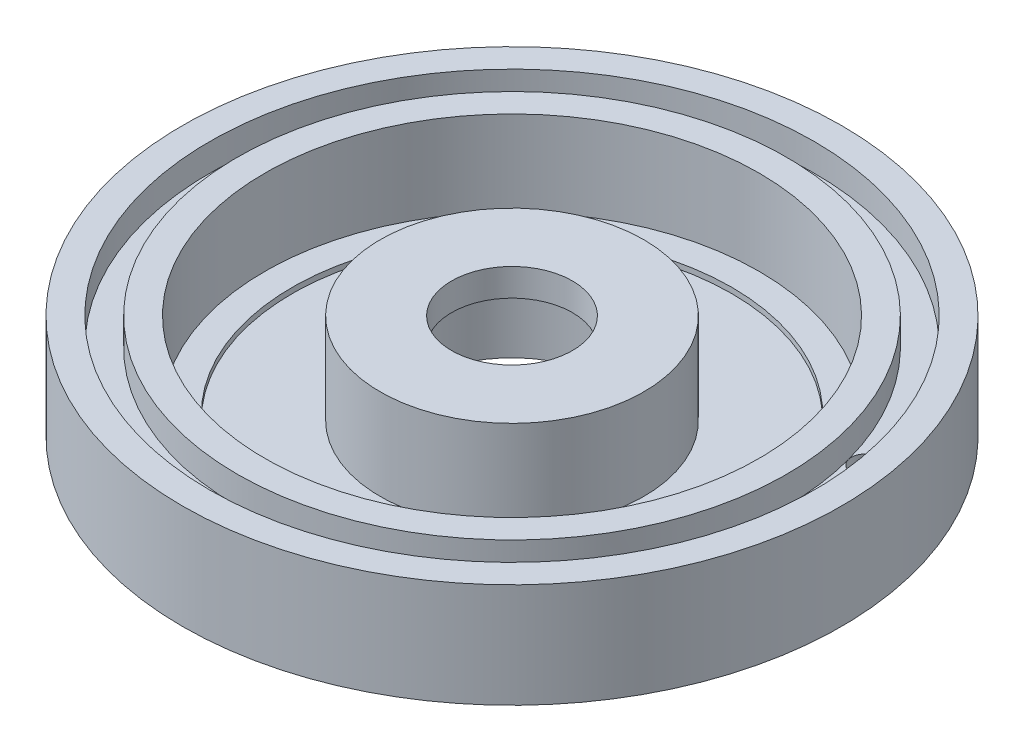
ISO-10303-21;
HEADER;
FILE_DESCRIPTION(('STEP AP214'),'2;1');
FILE_NAME('part.step','',(''),(''),'','','');
FILE_SCHEMA(('AUTOMOTIVE_DESIGN { 1 0 10303 214 1 1 1 1 }'));
ENDSEC;
DATA;
#1=APPLICATION_CONTEXT('core data for automotive mechanical design processes');
#2=APPLICATION_PROTOCOL_DEFINITION('international standard','automotive_design',2000,#1);
#3=PRODUCT_CONTEXT('',#1,'mechanical');
#4=PRODUCT('Part','Part','',(#3));
#5=PRODUCT_RELATED_PRODUCT_CATEGORY('part','',(#4));
#6=PRODUCT_DEFINITION_FORMATION('','',#4);
#7=PRODUCT_DEFINITION_CONTEXT('part definition',#1,'design');
#8=PRODUCT_DEFINITION('design','',#6,#7);
#9=PRODUCT_DEFINITION_SHAPE('','',#8);
#10=(LENGTH_UNIT() NAMED_UNIT(*) SI_UNIT(.MILLI.,.METRE.));
#11=(NAMED_UNIT(*) PLANE_ANGLE_UNIT() SI_UNIT($,.RADIAN.));
#12=(NAMED_UNIT(*) SI_UNIT($,.STERADIAN.) SOLID_ANGLE_UNIT());
#13=UNCERTAINTY_MEASURE_WITH_UNIT(LENGTH_MEASURE(1.E-05),#10,'distance_accuracy_value','');
#14=(GEOMETRIC_REPRESENTATION_CONTEXT(3) GLOBAL_UNCERTAINTY_ASSIGNED_CONTEXT((#13)) GLOBAL_UNIT_ASSIGNED_CONTEXT((#10,
#11,#12)) REPRESENTATION_CONTEXT('',''));
#15=CARTESIAN_POINT('',(0.,0.,0.));
#16=DIRECTION('',(0.,0.,1.));
#17=DIRECTION('',(1.,0.,0.));
#18=AXIS2_PLACEMENT_3D('',#15,#16,#17);
#19=CARTESIAN_POINT('',(0.,14.,0.));
#20=DIRECTION('',(0.,1.,0.));
#21=DIRECTION('',(0.,0.,1.));
#22=AXIS2_PLACEMENT_3D('',#19,#20,#21);
#23=PLANE('',#22);
#24=CARTESIAN_POINT('',(50.7111058801761,14.,-13.5879998678824));
#25=DIRECTION('',(0.,1.,0.));
#26=DIRECTION('',(0.,0.,1.));
#27=AXIS2_PLACEMENT_3D('',#24,#25,#26);
#28=CIRCLE('',#27,2.49999999999999);
#29=CARTESIAN_POINT('',(53.1259204458987,14.,-14.2350474806387));
#30=VERTEX_POINT('',#29);
#31=CARTESIAN_POINT('',(48.2962913144534,14.,-12.9409522551261));
#32=VERTEX_POINT('',#31);
#33=EDGE_CURVE('E54',#30,#32,#28,.T.);
#34=ORIENTED_EDGE('',*,*,#33,.F.);
#35=CARTESIAN_POINT('',(0.,14.,0.));
#36=DIRECTION('',(0.,1.,0.));
#37=DIRECTION('',(0.,0.,1.));
#38=AXIS2_PLACEMENT_3D('',#35,#36,#37);
#39=CIRCLE('',#38,55.);
#40=CARTESIAN_POINT('',(53.1259204458987,14.,14.2350474806387));
#41=VERTEX_POINT('',#40);
#42=EDGE_CURVE('E131',#30,#41,#39,.T.);
#43=ORIENTED_EDGE('',*,*,#42,.T.);
#44=CARTESIAN_POINT('',(50.7111058801761,14.,13.5879998678824));
#45=DIRECTION('',(0.,1.,0.));
#46=DIRECTION('',(0.,0.,1.));
#47=AXIS2_PLACEMENT_3D('',#44,#45,#46);
#48=CIRCLE('',#47,2.49999999999999);
#49=CARTESIAN_POINT('',(48.2962913144534,14.,12.9409522551261));
#50=VERTEX_POINT('',#49);
#51=EDGE_CURVE('E91',#50,#41,#48,.T.);
#52=ORIENTED_EDGE('',*,*,#51,.F.);
#53=CARTESIAN_POINT('',(0.,14.,0.));
#54=DIRECTION('',(0.,1.,0.));
#55=DIRECTION('',(0.,0.,1.));
#56=AXIS2_PLACEMENT_3D('',#53,#54,#55);
#57=CIRCLE('',#56,50.);
#58=EDGE_CURVE('E61',#32,#50,#57,.T.);
#59=ORIENTED_EDGE('',*,*,#58,.F.);
#60=EDGE_LOOP('',(#34,#43,#52,#59));
#61=FACE_BOUND('',#60,.T.);
#62=ADVANCED_FACE('F38',(#61),#23,.T.);
#63=CARTESIAN_POINT('',(0.,19.,0.));
#64=DIRECTION('',(0.,-1.,0.));
#65=DIRECTION('',(0.,0.,-1.));
#66=AXIS2_PLACEMENT_3D('',#63,#64,#65);
#67=CYLINDRICAL_SURFACE('',#66,60.);
#68=CARTESIAN_POINT('',(0.,19.,0.));
#69=DIRECTION('',(0.,1.,0.));
#70=DIRECTION('',(0.,0.,1.));
#71=AXIS2_PLACEMENT_3D('',#68,#69,#70);
#72=CIRCLE('',#71,60.);
#73=CARTESIAN_POINT('',(0.,19.,60.));
#74=VERTEX_POINT('',#73);
#75=EDGE_CURVE('E11',#74,#74,#72,.T.);
#76=ORIENTED_EDGE('',*,*,#75,.F.);
#77=EDGE_LOOP('',(#76));
#78=FACE_BOUND('',#77,.T.);
#79=CARTESIAN_POINT('',(0.,0.,0.));
#80=DIRECTION('',(0.,1.,0.));
#81=DIRECTION('',(0.,0.,1.));
#82=AXIS2_PLACEMENT_3D('',#79,#80,#81);
#83=CIRCLE('',#82,60.);
#84=CARTESIAN_POINT('',(0.,0.,60.));
#85=VERTEX_POINT('',#84);
#86=EDGE_CURVE('E47',#85,#85,#83,.T.);
#87=ORIENTED_EDGE('',*,*,#86,.T.);
#88=EDGE_LOOP('',(#87));
#89=FACE_BOUND('',#88,.T.);
#90=ADVANCED_FACE('F40',(#78,#89),#67,.T.);
#91=CARTESIAN_POINT('',(0.,19.,0.));
#92=DIRECTION('',(0.,1.,0.));
#93=DIRECTION('',(0.,0.,1.));
#94=AXIS2_PLACEMENT_3D('',#91,#92,#93);
#95=PLANE('',#94);
#96=CARTESIAN_POINT('',(0.,19.,0.));
#97=DIRECTION('',(0.,1.,0.));
#98=DIRECTION('',(0.,0.,1.));
#99=AXIS2_PLACEMENT_3D('',#96,#97,#98);
#100=CIRCLE('',#99,55.);
#101=CARTESIAN_POINT('',(0.,19.,55.));
#102=VERTEX_POINT('',#101);
#103=EDGE_CURVE('E125',#102,#102,#100,.T.);
#104=ORIENTED_EDGE('',*,*,#103,.F.);
#105=EDGE_LOOP('',(#104));
#106=FACE_BOUND('',#105,.T.);
#107=ORIENTED_EDGE('',*,*,#75,.T.);
#108=EDGE_LOOP('',(#107));
#109=FACE_BOUND('',#108,.T.);
#110=ADVANCED_FACE('F140',(#106,#109),#95,.T.);
#111=CARTESIAN_POINT('',(0.,0.,0.));
#112=DIRECTION('',(0.,1.,0.));
#113=DIRECTION('',(0.,0.,1.));
#114=AXIS2_PLACEMENT_3D('',#111,#112,#113);
#115=PLANE('',#114);
#116=CARTESIAN_POINT('',(0.,0.,0.));
#117=DIRECTION('',(0.,-1.,0.));
#118=DIRECTION('',(0.,0.,-1.));
#119=AXIS2_PLACEMENT_3D('',#116,#117,#118);
#120=CIRCLE('',#119,17.5);
#121=CARTESIAN_POINT('',(0.,0.,-17.5));
#122=VERTEX_POINT('',#121);
#123=EDGE_CURVE('E95',#122,#122,#120,.T.);
#124=ORIENTED_EDGE('',*,*,#123,.F.);
#125=EDGE_LOOP('',(#124));
#126=FACE_BOUND('',#125,.T.);
#127=ORIENTED_EDGE('',*,*,#86,.F.);
#128=EDGE_LOOP('',(#127));
#129=FACE_BOUND('',#128,.T.);
#130=ADVANCED_FACE('F137',(#126,#129),#115,.F.);
#131=CARTESIAN_POINT('',(0.,14.,0.));
#132=DIRECTION('',(0.,1.,0.));
#133=DIRECTION('',(0.,0.,1.));
#134=AXIS2_PLACEMENT_3D('',#131,#132,#133);
#135=CYLINDRICAL_SURFACE('',#134,55.);
#136=ORIENTED_EDGE('',*,*,#103,.T.);
#137=EDGE_LOOP('',(#136));
#138=FACE_BOUND('',#137,.T.);
#139=EDGE_CURVE('E128',#41,#30,#39,.T.);
#140=ORIENTED_EDGE('',*,*,#139,.F.);
#141=ORIENTED_EDGE('',*,*,#42,.F.);
#142=EDGE_LOOP('',(#140,#141));
#143=FACE_BOUND('',#142,.T.);
#144=ADVANCED_FACE('F139',(#138,#143),#135,.F.);
#145=EDGE_CURVE('E84',#32,#30,#28,.T.);
#146=ORIENTED_EDGE('',*,*,#145,.F.);
#147=EDGE_CURVE('E123',#50,#32,#57,.T.);
#148=ORIENTED_EDGE('',*,*,#147,.F.);
#149=EDGE_CURVE('E94',#41,#50,#48,.T.);
#150=ORIENTED_EDGE('',*,*,#149,.F.);
#151=ORIENTED_EDGE('',*,*,#139,.T.);
#152=EDGE_LOOP('',(#146,#148,#150,#151));
#153=FACE_BOUND('',#152,.T.);
#154=ADVANCED_FACE('F146',(#153),#23,.T.);
#155=CARTESIAN_POINT('',(0.,14.,0.));
#156=DIRECTION('',(0.,1.,0.));
#157=DIRECTION('',(0.,0.,1.));
#158=AXIS2_PLACEMENT_3D('',#155,#156,#157);
#159=CYLINDRICAL_SURFACE('',#158,50.);
#160=CARTESIAN_POINT('',(0.,19.,0.));
#161=DIRECTION('',(0.,1.,0.));
#162=DIRECTION('',(0.,0.,1.));
#163=AXIS2_PLACEMENT_3D('',#160,#161,#162);
#164=CIRCLE('',#163,50.);
#165=CARTESIAN_POINT('',(0.,19.,50.));
#166=VERTEX_POINT('',#165);
#167=EDGE_CURVE('E122',#166,#166,#164,.T.);
#168=ORIENTED_EDGE('',*,*,#167,.F.);
#169=EDGE_LOOP('',(#168));
#170=FACE_BOUND('',#169,.T.);
#171=ORIENTED_EDGE('',*,*,#147,.T.);
#172=ORIENTED_EDGE('',*,*,#58,.T.);
#173=EDGE_LOOP('',(#171,#172));
#174=FACE_BOUND('',#173,.T.);
#175=ADVANCED_FACE('F162',(#170,#174),#159,.T.);
#176=CARTESIAN_POINT('',(0.,19.,0.));
#177=DIRECTION('',(0.,-1.,0.));
#178=DIRECTION('',(0.,0.,-1.));
#179=AXIS2_PLACEMENT_3D('',#176,#177,#178);
#180=CIRCLE('',#179,45.);
#181=CARTESIAN_POINT('',(0.,19.,-45.));
#182=VERTEX_POINT('',#181);
#183=EDGE_CURVE('E119',#182,#182,#180,.T.);
#184=ORIENTED_EDGE('',*,*,#183,.T.);
#185=EDGE_LOOP('',(#184));
#186=FACE_BOUND('',#185,.T.);
#187=ORIENTED_EDGE('',*,*,#167,.T.);
#188=EDGE_LOOP('',(#187));
#189=FACE_BOUND('',#188,.T.);
#190=ADVANCED_FACE('F151',(#186,#189),#95,.T.);
#191=CARTESIAN_POINT('',(0.,0.,0.));
#192=DIRECTION('',(0.,-1.,0.));
#193=DIRECTION('',(0.,0.,-1.));
#194=AXIS2_PLACEMENT_3D('',#191,#192,#193);
#195=CYLINDRICAL_SURFACE('',#194,45.);
#196=ORIENTED_EDGE('',*,*,#183,.F.);
#197=EDGE_LOOP('',(#196));
#198=FACE_BOUND('',#197,.T.);
#199=CARTESIAN_POINT('',(0.,3.5,0.));
#200=DIRECTION('',(0.,-1.,0.));
#201=DIRECTION('',(0.,0.,-1.));
#202=AXIS2_PLACEMENT_3D('',#199,#200,#201);
#203=CIRCLE('',#202,45.);
#204=CARTESIAN_POINT('',(0.,3.5,-45.));
#205=VERTEX_POINT('',#204);
#206=EDGE_CURVE('E116',#205,#205,#203,.T.);
#207=ORIENTED_EDGE('',*,*,#206,.T.);
#208=EDGE_LOOP('',(#207));
#209=FACE_BOUND('',#208,.T.);
#210=ADVANCED_FACE('F218',(#198,#209),#195,.F.);
#211=CARTESIAN_POINT('',(45.,3.5,0.));
#212=DIRECTION('',(0.,-1.,0.));
#213=DIRECTION('',(0.,0.,-1.));
#214=AXIS2_PLACEMENT_3D('',#211,#212,#213);
#215=PLANE('',#214);
#216=ORIENTED_EDGE('',*,*,#206,.F.);
#217=EDGE_LOOP('',(#216));
#218=FACE_BOUND('',#217,.T.);
#219=CARTESIAN_POINT('',(0.,3.5,0.));
#220=DIRECTION('',(0.,-1.,0.));
#221=DIRECTION('',(0.,0.,-1.));
#222=AXIS2_PLACEMENT_3D('',#219,#220,#221);
#223=CIRCLE('',#222,40.);
#224=CARTESIAN_POINT('',(0.,3.5,-40.));
#225=VERTEX_POINT('',#224);
#226=EDGE_CURVE('E113',#225,#225,#223,.T.);
#227=ORIENTED_EDGE('',*,*,#226,.T.);
#228=EDGE_LOOP('',(#227));
#229=FACE_BOUND('',#228,.T.);
#230=ADVANCED_FACE('F214',(#218,#229),#215,.F.);
#231=CARTESIAN_POINT('',(0.,0.,0.));
#232=DIRECTION('',(0.,-1.,0.));
#233=DIRECTION('',(0.,0.,-1.));
#234=AXIS2_PLACEMENT_3D('',#231,#232,#233);
#235=CYLINDRICAL_SURFACE('',#234,40.);
#236=ORIENTED_EDGE('',*,*,#226,.F.);
#237=EDGE_LOOP('',(#236));
#238=FACE_BOUND('',#237,.T.);
#239=CARTESIAN_POINT('',(0.,2.5,0.));
#240=DIRECTION('',(0.,-1.,0.));
#241=DIRECTION('',(0.,0.,-1.));
#242=AXIS2_PLACEMENT_3D('',#239,#240,#241);
#243=CIRCLE('',#242,40.);
#244=CARTESIAN_POINT('',(0.,2.5,-40.));
#245=VERTEX_POINT('',#244);
#246=EDGE_CURVE('E110',#245,#245,#243,.T.);
#247=ORIENTED_EDGE('',*,*,#246,.T.);
#248=EDGE_LOOP('',(#247));
#249=FACE_BOUND('',#248,.T.);
#250=ADVANCED_FACE('F210',(#238,#249),#235,.F.);
#251=CARTESIAN_POINT('',(40.,2.5,0.));
#252=DIRECTION('',(0.,-1.,0.));
#253=DIRECTION('',(0.,0.,-1.));
#254=AXIS2_PLACEMENT_3D('',#251,#252,#253);
#255=PLANE('',#254);
#256=CARTESIAN_POINT('',(0.,2.5,0.));
#257=DIRECTION('',(0.,-1.,0.));
#258=DIRECTION('',(0.,0.,-1.));
#259=AXIS2_PLACEMENT_3D('',#256,#257,#258);
#260=CIRCLE('',#259,24.);
#261=CARTESIAN_POINT('',(0.,2.5,-24.));
#262=VERTEX_POINT('',#261);
#263=EDGE_CURVE('E42',#262,#262,#260,.T.);
#264=ORIENTED_EDGE('',*,*,#263,.T.);
#265=EDGE_LOOP('',(#264));
#266=FACE_BOUND('',#265,.T.);
#267=ORIENTED_EDGE('',*,*,#246,.F.);
#268=EDGE_LOOP('',(#267));
#269=FACE_BOUND('',#268,.T.);
#270=ADVANCED_FACE('F206',(#266,#269),#255,.F.);
#271=CARTESIAN_POINT('',(0.,0.,0.));
#272=DIRECTION('',(0.,-1.,0.));
#273=DIRECTION('',(0.,0.,-1.));
#274=AXIS2_PLACEMENT_3D('',#271,#272,#273);
#275=CYLINDRICAL_SURFACE('',#274,17.5);
#276=CARTESIAN_POINT('',(0.,14.,0.));
#277=DIRECTION('',(0.,-1.,0.));
#278=DIRECTION('',(0.,0.,-1.));
#279=AXIS2_PLACEMENT_3D('',#276,#277,#278);
#280=CIRCLE('',#279,17.5);
#281=CARTESIAN_POINT('',(0.,14.,-17.5));
#282=VERTEX_POINT('',#281);
#283=EDGE_CURVE('E107',#282,#282,#280,.T.);
#284=ORIENTED_EDGE('',*,*,#283,.F.);
#285=EDGE_LOOP('',(#284));
#286=FACE_BOUND('',#285,.T.);
#287=ORIENTED_EDGE('',*,*,#123,.T.);
#288=EDGE_LOOP('',(#287));
#289=FACE_BOUND('',#288,.T.);
#290=ADVANCED_FACE('F195',(#286,#289),#275,.F.);
#291=CARTESIAN_POINT('',(0.,0.,0.));
#292=DIRECTION('',(0.,-1.,0.));
#293=DIRECTION('',(0.,0.,-1.));
#294=AXIS2_PLACEMENT_3D('',#291,#292,#293);
#295=CYLINDRICAL_SURFACE('',#294,24.);
#296=CARTESIAN_POINT('',(0.,19.,0.));
#297=DIRECTION('',(0.,-1.,0.));
#298=DIRECTION('',(0.,0.,-1.));
#299=AXIS2_PLACEMENT_3D('',#296,#297,#298);
#300=CIRCLE('',#299,24.);
#301=CARTESIAN_POINT('',(0.,19.,-24.));
#302=VERTEX_POINT('',#301);
#303=EDGE_CURVE('E98',#302,#302,#300,.T.);
#304=ORIENTED_EDGE('',*,*,#303,.T.);
#305=EDGE_LOOP('',(#304));
#306=FACE_BOUND('',#305,.T.);
#307=ORIENTED_EDGE('',*,*,#263,.F.);
#308=EDGE_LOOP('',(#307));
#309=FACE_BOUND('',#308,.T.);
#310=ADVANCED_FACE('F192',(#306,#309),#295,.T.);
#311=CARTESIAN_POINT('',(17.5,14.,0.));
#312=DIRECTION('',(0.,-1.,0.));
#313=DIRECTION('',(0.,0.,-1.));
#314=AXIS2_PLACEMENT_3D('',#311,#312,#313);
#315=PLANE('',#314);
#316=ORIENTED_EDGE('',*,*,#283,.T.);
#317=EDGE_LOOP('',(#316));
#318=FACE_BOUND('',#317,.T.);
#319=CARTESIAN_POINT('',(0.,14.,0.));
#320=DIRECTION('',(0.,-1.,0.));
#321=DIRECTION('',(0.,0.,-1.));
#322=AXIS2_PLACEMENT_3D('',#319,#320,#321);
#323=CIRCLE('',#322,11.);
#324=CARTESIAN_POINT('',(0.,14.,-11.));
#325=VERTEX_POINT('',#324);
#326=EDGE_CURVE('E104',#325,#325,#323,.T.);
#327=ORIENTED_EDGE('',*,*,#326,.F.);
#328=EDGE_LOOP('',(#327));
#329=FACE_BOUND('',#328,.T.);
#330=ADVANCED_FACE('F194',(#318,#329),#315,.T.);
#331=CARTESIAN_POINT('',(0.,0.,0.));
#332=DIRECTION('',(0.,-1.,0.));
#333=DIRECTION('',(0.,0.,-1.));
#334=AXIS2_PLACEMENT_3D('',#331,#332,#333);
#335=CYLINDRICAL_SURFACE('',#334,11.);
#336=ORIENTED_EDGE('',*,*,#326,.T.);
#337=EDGE_LOOP('',(#336));
#338=FACE_BOUND('',#337,.T.);
#339=CARTESIAN_POINT('',(0.,19.,0.));
#340=DIRECTION('',(0.,-1.,0.));
#341=DIRECTION('',(0.,0.,-1.));
#342=AXIS2_PLACEMENT_3D('',#339,#340,#341);
#343=CIRCLE('',#342,11.);
#344=CARTESIAN_POINT('',(0.,19.,-11.));
#345=VERTEX_POINT('',#344);
#346=EDGE_CURVE('E101',#345,#345,#343,.T.);
#347=ORIENTED_EDGE('',*,*,#346,.F.);
#348=EDGE_LOOP('',(#347));
#349=FACE_BOUND('',#348,.T.);
#350=ADVANCED_FACE('F188',(#338,#349),#335,.F.);
#351=CARTESIAN_POINT('',(11.,19.,0.));
#352=DIRECTION('',(0.,1.,0.));
#353=DIRECTION('',(0.,0.,1.));
#354=AXIS2_PLACEMENT_3D('',#351,#352,#353);
#355=PLANE('',#354);
#356=ORIENTED_EDGE('',*,*,#346,.T.);
#357=EDGE_LOOP('',(#356));
#358=FACE_BOUND('',#357,.T.);
#359=ORIENTED_EDGE('',*,*,#303,.F.);
#360=EDGE_LOOP('',(#359));
#361=FACE_BOUND('',#360,.T.);
#362=ADVANCED_FACE('F182',(#358,#361),#355,.T.);
#363=CARTESIAN_POINT('',(50.7111058801761,4.,13.5879998678824));
#364=DIRECTION('',(0.,1.,0.));
#365=DIRECTION('',(0.,0.,1.));
#366=AXIS2_PLACEMENT_3D('',#363,#364,#365);
#367=CONICAL_SURFACE('',#366,2.49999999999999,1.02974425867665);
#368=CARTESIAN_POINT('',(50.7111058801761,2.4978484524311,13.5879998678824));
#369=VERTEX_POINT('',#368);
#370=VERTEX_LOOP('',#369);
#371=FACE_BOUND('',#370,.T.);
#372=CARTESIAN_POINT('',(50.7111058801761,4.,13.5879998678824));
#373=DIRECTION('',(0.,1.,0.));
#374=DIRECTION('',(0.,0.,1.));
#375=AXIS2_PLACEMENT_3D('',#372,#373,#374);
#376=CIRCLE('',#375,2.49999999999999);
#377=CARTESIAN_POINT('',(50.7111058801761,4.,16.0879998678824));
#378=VERTEX_POINT('',#377);
#379=EDGE_CURVE('E88',#378,#378,#376,.T.);
#380=ORIENTED_EDGE('',*,*,#379,.T.);
#381=EDGE_LOOP('',(#380));
#382=FACE_BOUND('',#381,.T.);
#383=ADVANCED_FACE('F177',(#371,#382),#367,.F.);
#384=CARTESIAN_POINT('',(50.7111058801761,19.,13.5879998678824));
#385=DIRECTION('',(0.,1.,0.));
#386=DIRECTION('',(0.,0.,1.));
#387=AXIS2_PLACEMENT_3D('',#384,#385,#386);
#388=CYLINDRICAL_SURFACE('',#387,2.49999999999999);
#389=ORIENTED_EDGE('',*,*,#149,.T.);
#390=ORIENTED_EDGE('',*,*,#51,.T.);
#391=EDGE_LOOP('',(#389,#390));
#392=FACE_BOUND('',#391,.T.);
#393=ORIENTED_EDGE('',*,*,#379,.F.);
#394=EDGE_LOOP('',(#393));
#395=FACE_BOUND('',#394,.T.);
#396=ADVANCED_FACE('F78',(#392,#395),#388,.F.);
#397=CARTESIAN_POINT('',(50.7111058801761,4.,-13.5879998678824));
#398=DIRECTION('',(0.,1.,0.));
#399=DIRECTION('',(0.,0.,1.));
#400=AXIS2_PLACEMENT_3D('',#397,#398,#399);
#401=CONICAL_SURFACE('',#400,2.49999999999999,1.02974425867665);
#402=CARTESIAN_POINT('',(50.7111058801761,2.4978484524311,-13.5879998678824));
#403=VERTEX_POINT('',#402);
#404=VERTEX_LOOP('',#403);
#405=FACE_BOUND('',#404,.T.);
#406=CARTESIAN_POINT('',(50.7111058801761,4.,-13.5879998678824));
#407=DIRECTION('',(0.,1.,0.));
#408=DIRECTION('',(0.,0.,1.));
#409=AXIS2_PLACEMENT_3D('',#406,#407,#408);
#410=CIRCLE('',#409,2.49999999999999);
#411=CARTESIAN_POINT('',(50.7111058801761,4.,-11.0879998678824));
#412=VERTEX_POINT('',#411);
#413=EDGE_CURVE('E82',#412,#412,#410,.T.);
#414=ORIENTED_EDGE('',*,*,#413,.T.);
#415=EDGE_LOOP('',(#414));
#416=FACE_BOUND('',#415,.T.);
#417=ADVANCED_FACE('F74',(#405,#416),#401,.F.);
#418=CARTESIAN_POINT('',(50.7111058801761,19.,-13.5879998678824));
#419=DIRECTION('',(0.,1.,0.));
#420=DIRECTION('',(0.,0.,1.));
#421=AXIS2_PLACEMENT_3D('',#418,#419,#420);
#422=CYLINDRICAL_SURFACE('',#421,2.49999999999999);
#423=ORIENTED_EDGE('',*,*,#33,.T.);
#424=ORIENTED_EDGE('',*,*,#145,.T.);
#425=EDGE_LOOP('',(#423,#424));
#426=FACE_BOUND('',#425,.T.);
#427=ORIENTED_EDGE('',*,*,#413,.F.);
#428=EDGE_LOOP('',(#427));
#429=FACE_BOUND('',#428,.T.);
#430=ADVANCED_FACE('F77',(#426,#429),#422,.F.);
#431=CLOSED_SHELL('',(#62,#90,#110,#130,#144,#154,#175,#190,#210,#230,#250,#270,#290,#310,#330,
#350,#362,#383,#396,#417,#430));
#432=MANIFOLD_SOLID_BREP('B2',#431);
#433=ADVANCED_BREP_SHAPE_REPRESENTATION('',(#18,#432),#14);
#434=SHAPE_DEFINITION_REPRESENTATION(#9,#433);
ENDSEC;
END-ISO-10303-21;
